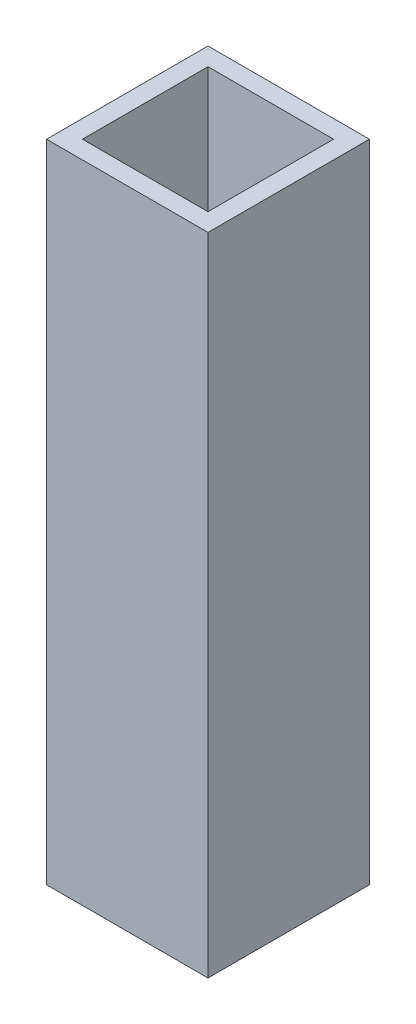
ISO-10303-21;
HEADER;
FILE_DESCRIPTION(('STEP AP214'),'2;1');
FILE_NAME('part.step','',(''),(''),'','','');
FILE_SCHEMA(('AUTOMOTIVE_DESIGN { 1 0 10303 214 1 1 1 1 }'));
ENDSEC;
DATA;
#1=APPLICATION_CONTEXT('core data for automotive mechanical design processes');
#2=APPLICATION_PROTOCOL_DEFINITION('international standard','automotive_design',2000,#1);
#3=PRODUCT_CONTEXT('',#1,'mechanical');
#4=PRODUCT('Part','Part','',(#3));
#5=PRODUCT_RELATED_PRODUCT_CATEGORY('part','',(#4));
#6=PRODUCT_DEFINITION_FORMATION('','',#4);
#7=PRODUCT_DEFINITION_CONTEXT('part definition',#1,'design');
#8=PRODUCT_DEFINITION('design','',#6,#7);
#9=PRODUCT_DEFINITION_SHAPE('','',#8);
#10=(LENGTH_UNIT() NAMED_UNIT(*) SI_UNIT(.MILLI.,.METRE.));
#11=(NAMED_UNIT(*) PLANE_ANGLE_UNIT() SI_UNIT($,.RADIAN.));
#12=(NAMED_UNIT(*) SI_UNIT($,.STERADIAN.) SOLID_ANGLE_UNIT());
#13=UNCERTAINTY_MEASURE_WITH_UNIT(LENGTH_MEASURE(1.E-05),#10,'distance_accuracy_value','');
#14=(GEOMETRIC_REPRESENTATION_CONTEXT(3) GLOBAL_UNCERTAINTY_ASSIGNED_CONTEXT((#13)) GLOBAL_UNIT_ASSIGNED_CONTEXT((#10,
#11,#12)) REPRESENTATION_CONTEXT('',''));
#15=CARTESIAN_POINT('',(0.,0.,0.));
#16=DIRECTION('',(0.,0.,1.));
#17=DIRECTION('',(1.,0.,0.));
#18=AXIS2_PLACEMENT_3D('',#15,#16,#17);
#19=CARTESIAN_POINT('',(0.,18.,0.));
#20=DIRECTION('',(0.,1.,0.));
#21=DIRECTION('',(0.,0.,1.));
#22=AXIS2_PLACEMENT_3D('',#19,#20,#21);
#23=PLANE('',#22);
#24=DIRECTION('',(0.,0.,-1.));
#25=VECTOR('',#24,1.);
#26=CARTESIAN_POINT('',(2.25,18.,-2.25));
#27=LINE('',#26,#25);
#28=CARTESIAN_POINT('',(2.25,18.,2.25));
#29=VERTEX_POINT('',#28);
#30=CARTESIAN_POINT('',(2.25,18.,-2.25));
#31=VERTEX_POINT('',#30);
#32=EDGE_CURVE('E153',#29,#31,#27,.T.);
#33=ORIENTED_EDGE('',*,*,#32,.T.);
#34=DIRECTION('',(-1.,0.,0.));
#35=VECTOR('',#34,1.);
#36=CARTESIAN_POINT('',(-2.25,18.,-2.25));
#37=LINE('',#36,#35);
#38=CARTESIAN_POINT('',(-2.25,18.,-2.25));
#39=VERTEX_POINT('',#38);
#40=EDGE_CURVE('E157',#31,#39,#37,.T.);
#41=ORIENTED_EDGE('',*,*,#40,.T.);
#42=DIRECTION('',(0.,0.,1.));
#43=VECTOR('',#42,1.);
#44=CARTESIAN_POINT('',(-2.25,18.,-2.25));
#45=LINE('',#44,#43);
#46=CARTESIAN_POINT('',(-2.25,18.,2.25));
#47=VERTEX_POINT('',#46);
#48=EDGE_CURVE('E161',#39,#47,#45,.T.);
#49=ORIENTED_EDGE('',*,*,#48,.T.);
#50=DIRECTION('',(1.,0.,0.));
#51=VECTOR('',#50,1.);
#52=CARTESIAN_POINT('',(-2.25,18.,2.25));
#53=LINE('',#52,#51);
#54=EDGE_CURVE('E164',#47,#29,#53,.T.);
#55=ORIENTED_EDGE('',*,*,#54,.T.);
#56=EDGE_LOOP('',(#33,#41,#49,#55));
#57=FACE_BOUND('',#56,.T.);
#58=DIRECTION('',(-1.,0.,0.));
#59=VECTOR('',#58,1.);
#60=CARTESIAN_POINT('',(-1.75,18.,-1.75));
#61=LINE('',#60,#59);
#62=CARTESIAN_POINT('',(1.75,18.,-1.75));
#63=VERTEX_POINT('',#62);
#64=CARTESIAN_POINT('',(-1.75,18.,-1.75));
#65=VERTEX_POINT('',#64);
#66=EDGE_CURVE('E114',#63,#65,#61,.T.);
#67=ORIENTED_EDGE('',*,*,#66,.F.);
#68=DIRECTION('',(0.,0.,-1.));
#69=VECTOR('',#68,1.);
#70=CARTESIAN_POINT('',(1.75,18.,-1.75));
#71=LINE('',#70,#69);
#72=CARTESIAN_POINT('',(1.75,18.,1.75));
#73=VERTEX_POINT('',#72);
#74=EDGE_CURVE('E105',#73,#63,#71,.T.);
#75=ORIENTED_EDGE('',*,*,#74,.F.);
#76=DIRECTION('',(1.,0.,0.));
#77=VECTOR('',#76,1.);
#78=CARTESIAN_POINT('',(-1.75,18.,1.75));
#79=LINE('',#78,#77);
#80=CARTESIAN_POINT('',(-1.75,18.,1.75));
#81=VERTEX_POINT('',#80);
#82=EDGE_CURVE('E131',#81,#73,#79,.T.);
#83=ORIENTED_EDGE('',*,*,#82,.F.);
#84=DIRECTION('',(0.,0.,1.));
#85=VECTOR('',#84,1.);
#86=CARTESIAN_POINT('',(-1.75,18.,-1.75));
#87=LINE('',#86,#85);
#88=EDGE_CURVE('E127',#65,#81,#87,.T.);
#89=ORIENTED_EDGE('',*,*,#88,.F.);
#90=EDGE_LOOP('',(#67,#75,#83,#89));
#91=FACE_BOUND('',#90,.T.);
#92=ADVANCED_FACE('F39',(#57,#91),#23,.T.);
#93=CARTESIAN_POINT('',(0.,0.,0.));
#94=DIRECTION('',(0.,1.,0.));
#95=DIRECTION('',(0.,0.,1.));
#96=AXIS2_PLACEMENT_3D('',#93,#94,#95);
#97=PLANE('',#96);
#98=DIRECTION('',(0.,0.,-1.));
#99=VECTOR('',#98,1.);
#100=CARTESIAN_POINT('',(2.25,0.,-2.25));
#101=LINE('',#100,#99);
#102=CARTESIAN_POINT('',(2.25,0.,2.25));
#103=VERTEX_POINT('',#102);
#104=CARTESIAN_POINT('',(2.25,0.,-2.25));
#105=VERTEX_POINT('',#104);
#106=EDGE_CURVE('E123',#103,#105,#101,.T.);
#107=ORIENTED_EDGE('',*,*,#106,.F.);
#108=DIRECTION('',(1.,0.,0.));
#109=VECTOR('',#108,1.);
#110=CARTESIAN_POINT('',(-2.25,0.,2.25));
#111=LINE('',#110,#109);
#112=CARTESIAN_POINT('',(-2.25,0.,2.25));
#113=VERTEX_POINT('',#112);
#114=EDGE_CURVE('E158',#113,#103,#111,.T.);
#115=ORIENTED_EDGE('',*,*,#114,.F.);
#116=DIRECTION('',(0.,0.,1.));
#117=VECTOR('',#116,1.);
#118=CARTESIAN_POINT('',(-2.25,0.,-2.25));
#119=LINE('',#118,#117);
#120=CARTESIAN_POINT('',(-2.25,0.,-2.25));
#121=VERTEX_POINT('',#120);
#122=EDGE_CURVE('E174',#121,#113,#119,.T.);
#123=ORIENTED_EDGE('',*,*,#122,.F.);
#124=DIRECTION('',(-1.,0.,0.));
#125=VECTOR('',#124,1.);
#126=CARTESIAN_POINT('',(-2.25,0.,-2.25));
#127=LINE('',#126,#125);
#128=EDGE_CURVE('E171',#105,#121,#127,.T.);
#129=ORIENTED_EDGE('',*,*,#128,.F.);
#130=EDGE_LOOP('',(#107,#115,#123,#129));
#131=FACE_BOUND('',#130,.T.);
#132=DIRECTION('',(0.,0.,-1.));
#133=VECTOR('',#132,1.);
#134=CARTESIAN_POINT('',(1.75,0.,-1.75));
#135=LINE('',#134,#133);
#136=CARTESIAN_POINT('',(1.75,0.,1.75));
#137=VERTEX_POINT('',#136);
#138=CARTESIAN_POINT('',(1.75,0.,-1.75));
#139=VERTEX_POINT('',#138);
#140=EDGE_CURVE('E63',#137,#139,#135,.T.);
#141=ORIENTED_EDGE('',*,*,#140,.T.);
#142=DIRECTION('',(-1.,0.,0.));
#143=VECTOR('',#142,1.);
#144=CARTESIAN_POINT('',(-1.75,0.,-1.75));
#145=LINE('',#144,#143);
#146=CARTESIAN_POINT('',(-1.75,0.,-1.75));
#147=VERTEX_POINT('',#146);
#148=EDGE_CURVE('E121',#139,#147,#145,.T.);
#149=ORIENTED_EDGE('',*,*,#148,.T.);
#150=DIRECTION('',(0.,0.,1.));
#151=VECTOR('',#150,1.);
#152=CARTESIAN_POINT('',(-1.75,0.,-1.75));
#153=LINE('',#152,#151);
#154=CARTESIAN_POINT('',(-1.75,0.,1.75));
#155=VERTEX_POINT('',#154);
#156=EDGE_CURVE('E140',#147,#155,#153,.T.);
#157=ORIENTED_EDGE('',*,*,#156,.T.);
#158=DIRECTION('',(1.,0.,0.));
#159=VECTOR('',#158,1.);
#160=CARTESIAN_POINT('',(-1.75,0.,1.75));
#161=LINE('',#160,#159);
#162=EDGE_CURVE('E115',#155,#137,#161,.T.);
#163=ORIENTED_EDGE('',*,*,#162,.T.);
#164=EDGE_LOOP('',(#141,#149,#157,#163));
#165=FACE_BOUND('',#164,.T.);
#166=ADVANCED_FACE('F197',(#131,#165),#97,.F.);
#167=CARTESIAN_POINT('',(2.25,18.,-2.25));
#168=DIRECTION('',(-1.,0.,0.));
#169=DIRECTION('',(0.,0.,1.));
#170=AXIS2_PLACEMENT_3D('',#167,#168,#169);
#171=PLANE('',#170);
#172=ORIENTED_EDGE('',*,*,#106,.T.);
#173=DIRECTION('',(0.,-1.,0.));
#174=VECTOR('',#173,1.);
#175=CARTESIAN_POINT('',(2.25,18.,-2.25));
#176=LINE('',#175,#174);
#177=EDGE_CURVE('E11',#31,#105,#176,.T.);
#178=ORIENTED_EDGE('',*,*,#177,.F.);
#179=ORIENTED_EDGE('',*,*,#32,.F.);
#180=DIRECTION('',(0.,-1.,0.));
#181=VECTOR('',#180,1.);
#182=CARTESIAN_POINT('',(2.25,18.,2.25));
#183=LINE('',#182,#181);
#184=EDGE_CURVE('E167',#29,#103,#183,.T.);
#185=ORIENTED_EDGE('',*,*,#184,.T.);
#186=EDGE_LOOP('',(#172,#178,#179,#185));
#187=FACE_BOUND('',#186,.T.);
#188=ADVANCED_FACE('F41',(#187),#171,.F.);
#189=CARTESIAN_POINT('',(-2.25,18.,-2.25));
#190=DIRECTION('',(0.,0.,1.));
#191=DIRECTION('',(1.,0.,0.));
#192=AXIS2_PLACEMENT_3D('',#189,#190,#191);
#193=PLANE('',#192);
#194=ORIENTED_EDGE('',*,*,#128,.T.);
#195=DIRECTION('',(0.,-1.,0.));
#196=VECTOR('',#195,1.);
#197=CARTESIAN_POINT('',(-2.25,18.,-2.25));
#198=LINE('',#197,#196);
#199=EDGE_CURVE('E48',#39,#121,#198,.T.);
#200=ORIENTED_EDGE('',*,*,#199,.F.);
#201=ORIENTED_EDGE('',*,*,#40,.F.);
#202=ORIENTED_EDGE('',*,*,#177,.T.);
#203=EDGE_LOOP('',(#194,#200,#201,#202));
#204=FACE_BOUND('',#203,.T.);
#205=ADVANCED_FACE('F207',(#204),#193,.F.);
#206=CARTESIAN_POINT('',(-2.25,18.,-2.25));
#207=DIRECTION('',(1.,0.,0.));
#208=DIRECTION('',(0.,0.,-1.));
#209=AXIS2_PLACEMENT_3D('',#206,#207,#208);
#210=PLANE('',#209);
#211=ORIENTED_EDGE('',*,*,#122,.T.);
#212=DIRECTION('',(0.,-1.,0.));
#213=VECTOR('',#212,1.);
#214=CARTESIAN_POINT('',(-2.25,18.,2.25));
#215=LINE('',#214,#213);
#216=EDGE_CURVE('E182',#47,#113,#215,.T.);
#217=ORIENTED_EDGE('',*,*,#216,.F.);
#218=ORIENTED_EDGE('',*,*,#48,.F.);
#219=ORIENTED_EDGE('',*,*,#199,.T.);
#220=EDGE_LOOP('',(#211,#217,#218,#219));
#221=FACE_BOUND('',#220,.T.);
#222=ADVANCED_FACE('F191',(#221),#210,.F.);
#223=CARTESIAN_POINT('',(-2.25,18.,2.25));
#224=DIRECTION('',(0.,0.,-1.));
#225=DIRECTION('',(-1.,0.,0.));
#226=AXIS2_PLACEMENT_3D('',#223,#224,#225);
#227=PLANE('',#226);
#228=ORIENTED_EDGE('',*,*,#114,.T.);
#229=ORIENTED_EDGE('',*,*,#184,.F.);
#230=ORIENTED_EDGE('',*,*,#54,.F.);
#231=ORIENTED_EDGE('',*,*,#216,.T.);
#232=EDGE_LOOP('',(#228,#229,#230,#231));
#233=FACE_BOUND('',#232,.T.);
#234=ADVANCED_FACE('F201',(#233),#227,.F.);
#235=CARTESIAN_POINT('',(1.75,18.,-1.75));
#236=DIRECTION('',(-1.,0.,0.));
#237=DIRECTION('',(0.,0.,1.));
#238=AXIS2_PLACEMENT_3D('',#235,#236,#237);
#239=PLANE('',#238);
#240=ORIENTED_EDGE('',*,*,#140,.F.);
#241=DIRECTION('',(0.,-1.,0.));
#242=VECTOR('',#241,1.);
#243=CARTESIAN_POINT('',(1.75,18.,1.75));
#244=LINE('',#243,#242);
#245=EDGE_CURVE('E109',#73,#137,#244,.T.);
#246=ORIENTED_EDGE('',*,*,#245,.F.);
#247=ORIENTED_EDGE('',*,*,#74,.T.);
#248=DIRECTION('',(0.,-1.,0.));
#249=VECTOR('',#248,1.);
#250=CARTESIAN_POINT('',(1.75,18.,-1.75));
#251=LINE('',#250,#249);
#252=EDGE_CURVE('E108',#63,#139,#251,.T.);
#253=ORIENTED_EDGE('',*,*,#252,.T.);
#254=EDGE_LOOP('',(#240,#246,#247,#253));
#255=FACE_BOUND('',#254,.T.);
#256=ADVANCED_FACE('F107',(#255),#239,.T.);
#257=CARTESIAN_POINT('',(-1.75,18.,-1.75));
#258=DIRECTION('',(0.,0.,1.));
#259=DIRECTION('',(1.,0.,0.));
#260=AXIS2_PLACEMENT_3D('',#257,#258,#259);
#261=PLANE('',#260);
#262=ORIENTED_EDGE('',*,*,#148,.F.);
#263=ORIENTED_EDGE('',*,*,#252,.F.);
#264=ORIENTED_EDGE('',*,*,#66,.T.);
#265=DIRECTION('',(0.,-1.,0.));
#266=VECTOR('',#265,1.);
#267=CARTESIAN_POINT('',(-1.75,18.,-1.75));
#268=LINE('',#267,#266);
#269=EDGE_CURVE('E124',#65,#147,#268,.T.);
#270=ORIENTED_EDGE('',*,*,#269,.T.);
#271=EDGE_LOOP('',(#262,#263,#264,#270));
#272=FACE_BOUND('',#271,.T.);
#273=ADVANCED_FACE('F118',(#272),#261,.T.);
#274=CARTESIAN_POINT('',(-1.75,18.,-1.75));
#275=DIRECTION('',(1.,0.,0.));
#276=DIRECTION('',(0.,0.,-1.));
#277=AXIS2_PLACEMENT_3D('',#274,#275,#276);
#278=PLANE('',#277);
#279=ORIENTED_EDGE('',*,*,#156,.F.);
#280=ORIENTED_EDGE('',*,*,#269,.F.);
#281=ORIENTED_EDGE('',*,*,#88,.T.);
#282=DIRECTION('',(0.,-1.,0.));
#283=VECTOR('',#282,1.);
#284=CARTESIAN_POINT('',(-1.75,18.,1.75));
#285=LINE('',#284,#283);
#286=EDGE_CURVE('E55',#81,#155,#285,.T.);
#287=ORIENTED_EDGE('',*,*,#286,.T.);
#288=EDGE_LOOP('',(#279,#280,#281,#287));
#289=FACE_BOUND('',#288,.T.);
#290=ADVANCED_FACE('F230',(#289),#278,.T.);
#291=CARTESIAN_POINT('',(-1.75,18.,1.75));
#292=DIRECTION('',(0.,0.,-1.));
#293=DIRECTION('',(-1.,0.,0.));
#294=AXIS2_PLACEMENT_3D('',#291,#292,#293);
#295=PLANE('',#294);
#296=ORIENTED_EDGE('',*,*,#162,.F.);
#297=ORIENTED_EDGE('',*,*,#286,.F.);
#298=ORIENTED_EDGE('',*,*,#82,.T.);
#299=ORIENTED_EDGE('',*,*,#245,.T.);
#300=EDGE_LOOP('',(#296,#297,#298,#299));
#301=FACE_BOUND('',#300,.T.);
#302=ADVANCED_FACE('F234',(#301),#295,.T.);
#303=CLOSED_SHELL('',(#92,#166,#188,#205,#222,#234,#256,#273,#290,#302));
#304=MANIFOLD_SOLID_BREP('B2',#303);
#305=ADVANCED_BREP_SHAPE_REPRESENTATION('',(#18,#304),#14);
#306=SHAPE_DEFINITION_REPRESENTATION(#9,#305);
ENDSEC;
END-ISO-10303-21;
